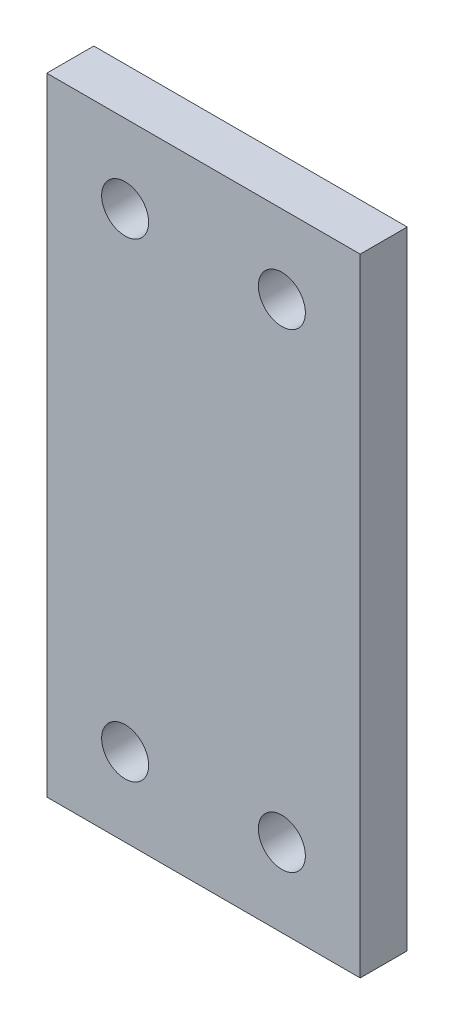
ISO-10303-21;
HEADER;
FILE_DESCRIPTION(('STEP AP214'),'2;1');
FILE_NAME('part.step','',(''),(''),'','','');
FILE_SCHEMA(('AUTOMOTIVE_DESIGN { 1 0 10303 214 1 1 1 1 }'));
ENDSEC;
DATA;
#1=APPLICATION_CONTEXT('core data for automotive mechanical design processes');
#2=APPLICATION_PROTOCOL_DEFINITION('international standard','automotive_design',2000,#1);
#3=PRODUCT_CONTEXT('',#1,'mechanical');
#4=PRODUCT('Part','Part','',(#3));
#5=PRODUCT_RELATED_PRODUCT_CATEGORY('part','',(#4));
#6=PRODUCT_DEFINITION_FORMATION('','',#4);
#7=PRODUCT_DEFINITION_CONTEXT('part definition',#1,'design');
#8=PRODUCT_DEFINITION('design','',#6,#7);
#9=PRODUCT_DEFINITION_SHAPE('','',#8);
#10=(LENGTH_UNIT() NAMED_UNIT(*) SI_UNIT(.MILLI.,.METRE.));
#11=(NAMED_UNIT(*) PLANE_ANGLE_UNIT() SI_UNIT($,.RADIAN.));
#12=(NAMED_UNIT(*) SI_UNIT($,.STERADIAN.) SOLID_ANGLE_UNIT());
#13=UNCERTAINTY_MEASURE_WITH_UNIT(LENGTH_MEASURE(1.E-05),#10,'distance_accuracy_value','');
#14=(GEOMETRIC_REPRESENTATION_CONTEXT(3) GLOBAL_UNCERTAINTY_ASSIGNED_CONTEXT((#13)) GLOBAL_UNIT_ASSIGNED_CONTEXT((#10,
#11,#12)) REPRESENTATION_CONTEXT('',''));
#15=CARTESIAN_POINT('',(0.,0.,0.));
#16=DIRECTION('',(0.,0.,1.));
#17=DIRECTION('',(1.,0.,0.));
#18=AXIS2_PLACEMENT_3D('',#15,#16,#17);
#19=CARTESIAN_POINT('',(0.,0.,0.));
#20=DIRECTION('',(0.,0.,-1.));
#21=DIRECTION('',(-1.,0.,0.));
#22=AXIS2_PLACEMENT_3D('',#19,#20,#21);
#23=PLANE('',#22);
#24=CARTESIAN_POINT('',(5.,5.,0.));
#25=DIRECTION('',(0.,0.,-1.));
#26=DIRECTION('',(-1.,0.,0.));
#27=AXIS2_PLACEMENT_3D('',#24,#25,#26);
#28=CIRCLE('',#27,1.5);
#29=CARTESIAN_POINT('',(3.5,5.,0.));
#30=VERTEX_POINT('',#29);
#31=EDGE_CURVE('E90',#30,#30,#28,.F.);
#32=ORIENTED_EDGE('',*,*,#31,.T.);
#33=EDGE_LOOP('',(#32));
#34=FACE_BOUND('',#33,.T.);
#35=CARTESIAN_POINT('',(15.,35.,0.));
#36=DIRECTION('',(0.,0.,-1.));
#37=DIRECTION('',(-1.,0.,0.));
#38=AXIS2_PLACEMENT_3D('',#35,#36,#37);
#39=CIRCLE('',#38,1.49999999999999);
#40=CARTESIAN_POINT('',(13.5,35.,0.));
#41=VERTEX_POINT('',#40);
#42=EDGE_CURVE('E95',#41,#41,#39,.F.);
#43=ORIENTED_EDGE('',*,*,#42,.T.);
#44=EDGE_LOOP('',(#43));
#45=FACE_BOUND('',#44,.T.);
#46=DIRECTION('',(0.,1.,0.));
#47=VECTOR('',#46,1.);
#48=CARTESIAN_POINT('',(20.,0.,0.));
#49=LINE('',#48,#47);
#50=CARTESIAN_POINT('',(20.,40.,0.));
#51=VERTEX_POINT('',#50);
#52=CARTESIAN_POINT('',(20.,0.,0.));
#53=VERTEX_POINT('',#52);
#54=EDGE_CURVE('E56',#51,#53,#49,.F.);
#55=ORIENTED_EDGE('',*,*,#54,.T.);
#56=DIRECTION('',(1.,0.,0.));
#57=VECTOR('',#56,1.);
#58=CARTESIAN_POINT('',(0.,0.,0.));
#59=LINE('',#58,#57);
#60=CARTESIAN_POINT('',(0.,0.,0.));
#61=VERTEX_POINT('',#60);
#62=EDGE_CURVE('E108',#53,#61,#59,.F.);
#63=ORIENTED_EDGE('',*,*,#62,.T.);
#64=DIRECTION('',(0.,1.,0.));
#65=VECTOR('',#64,1.);
#66=CARTESIAN_POINT('',(0.,0.,0.));
#67=LINE('',#66,#65);
#68=CARTESIAN_POINT('',(0.,40.,0.));
#69=VERTEX_POINT('',#68);
#70=EDGE_CURVE('E61',#61,#69,#67,.T.);
#71=ORIENTED_EDGE('',*,*,#70,.T.);
#72=DIRECTION('',(1.,0.,0.));
#73=VECTOR('',#72,1.);
#74=CARTESIAN_POINT('',(0.,40.,0.));
#75=LINE('',#74,#73);
#76=EDGE_CURVE('E59',#69,#51,#75,.T.);
#77=ORIENTED_EDGE('',*,*,#76,.T.);
#78=EDGE_LOOP('',(#55,#63,#71,#77));
#79=FACE_BOUND('',#78,.T.);
#80=CARTESIAN_POINT('',(5.,35.,0.));
#81=DIRECTION('',(0.,0.,-1.));
#82=DIRECTION('',(-1.,0.,0.));
#83=AXIS2_PLACEMENT_3D('',#80,#81,#82);
#84=CIRCLE('',#83,1.5);
#85=CARTESIAN_POINT('',(3.5,35.,0.));
#86=VERTEX_POINT('',#85);
#87=EDGE_CURVE('E20',#86,#86,#84,.F.);
#88=ORIENTED_EDGE('',*,*,#87,.T.);
#89=EDGE_LOOP('',(#88));
#90=FACE_BOUND('',#89,.T.);
#91=CARTESIAN_POINT('',(15.,5.,0.));
#92=DIRECTION('',(0.,0.,-1.));
#93=DIRECTION('',(-1.,0.,0.));
#94=AXIS2_PLACEMENT_3D('',#91,#92,#93);
#95=CIRCLE('',#94,1.49999999999999);
#96=CARTESIAN_POINT('',(13.5,5.,0.));
#97=VERTEX_POINT('',#96);
#98=EDGE_CURVE('E93',#97,#97,#95,.F.);
#99=ORIENTED_EDGE('',*,*,#98,.T.);
#100=EDGE_LOOP('',(#99));
#101=FACE_BOUND('',#100,.T.);
#102=ADVANCED_FACE('F17',(#34,#45,#79,#90,#101),#23,.T.);
#103=CARTESIAN_POINT('',(0.,40.,3.));
#104=DIRECTION('',(0.,-1.,0.));
#105=DIRECTION('',(0.,0.,-1.));
#106=AXIS2_PLACEMENT_3D('',#103,#104,#105);
#107=PLANE('',#106);
#108=DIRECTION('',(0.,0.,-1.));
#109=VECTOR('',#108,1.);
#110=CARTESIAN_POINT('',(0.,40.,3.));
#111=LINE('',#110,#109);
#112=CARTESIAN_POINT('',(0.,40.,3.));
#113=VERTEX_POINT('',#112);
#114=EDGE_CURVE('E102',#69,#113,#111,.F.);
#115=ORIENTED_EDGE('',*,*,#114,.T.);
#116=DIRECTION('',(-1.,0.,0.));
#117=VECTOR('',#116,1.);
#118=CARTESIAN_POINT('',(0.,40.,3.));
#119=LINE('',#118,#117);
#120=CARTESIAN_POINT('',(20.,40.,3.));
#121=VERTEX_POINT('',#120);
#122=EDGE_CURVE('E77',#113,#121,#119,.F.);
#123=ORIENTED_EDGE('',*,*,#122,.T.);
#124=DIRECTION('',(0.,0.,1.));
#125=VECTOR('',#124,1.);
#126=CARTESIAN_POINT('',(20.,40.,3.));
#127=LINE('',#126,#125);
#128=EDGE_CURVE('E66',#121,#51,#127,.F.);
#129=ORIENTED_EDGE('',*,*,#128,.T.);
#130=ORIENTED_EDGE('',*,*,#76,.F.);
#131=EDGE_LOOP('',(#115,#123,#129,#130));
#132=FACE_BOUND('',#131,.T.);
#133=ADVANCED_FACE('F76',(#132),#107,.F.);
#134=CARTESIAN_POINT('',(20.,0.,3.));
#135=DIRECTION('',(-1.,0.,0.));
#136=DIRECTION('',(0.,0.,1.));
#137=AXIS2_PLACEMENT_3D('',#134,#135,#136);
#138=PLANE('',#137);
#139=ORIENTED_EDGE('',*,*,#128,.F.);
#140=DIRECTION('',(0.,1.,0.));
#141=VECTOR('',#140,1.);
#142=CARTESIAN_POINT('',(20.,0.,3.));
#143=LINE('',#142,#141);
#144=CARTESIAN_POINT('',(20.,0.,3.));
#145=VERTEX_POINT('',#144);
#146=EDGE_CURVE('E116',#121,#145,#143,.F.);
#147=ORIENTED_EDGE('',*,*,#146,.T.);
#148=DIRECTION('',(0.,0.,1.));
#149=VECTOR('',#148,1.);
#150=CARTESIAN_POINT('',(20.,0.,3.));
#151=LINE('',#150,#149);
#152=EDGE_CURVE('E73',#145,#53,#151,.F.);
#153=ORIENTED_EDGE('',*,*,#152,.T.);
#154=ORIENTED_EDGE('',*,*,#54,.F.);
#155=EDGE_LOOP('',(#139,#147,#153,#154));
#156=FACE_BOUND('',#155,.T.);
#157=ADVANCED_FACE('F70',(#156),#138,.F.);
#158=CARTESIAN_POINT('',(0.,0.,3.));
#159=DIRECTION('',(0.,1.,0.));
#160=DIRECTION('',(0.,0.,1.));
#161=AXIS2_PLACEMENT_3D('',#158,#159,#160);
#162=PLANE('',#161);
#163=ORIENTED_EDGE('',*,*,#152,.F.);
#164=DIRECTION('',(-1.,0.,0.));
#165=VECTOR('',#164,1.);
#166=CARTESIAN_POINT('',(0.,0.,3.));
#167=LINE('',#166,#165);
#168=CARTESIAN_POINT('',(0.,0.,3.));
#169=VERTEX_POINT('',#168);
#170=EDGE_CURVE('E114',#145,#169,#167,.T.);
#171=ORIENTED_EDGE('',*,*,#170,.T.);
#172=DIRECTION('',(0.,0.,-1.));
#173=VECTOR('',#172,1.);
#174=CARTESIAN_POINT('',(0.,0.,3.));
#175=LINE('',#174,#173);
#176=EDGE_CURVE('E35',#169,#61,#175,.T.);
#177=ORIENTED_EDGE('',*,*,#176,.T.);
#178=ORIENTED_EDGE('',*,*,#62,.F.);
#179=EDGE_LOOP('',(#163,#171,#177,#178));
#180=FACE_BOUND('',#179,.T.);
#181=ADVANCED_FACE('F112',(#180),#162,.F.);
#182=CARTESIAN_POINT('',(0.,0.,3.));
#183=DIRECTION('',(1.,0.,0.));
#184=DIRECTION('',(0.,0.,-1.));
#185=AXIS2_PLACEMENT_3D('',#182,#183,#184);
#186=PLANE('',#185);
#187=ORIENTED_EDGE('',*,*,#176,.F.);
#188=DIRECTION('',(0.,1.,0.));
#189=VECTOR('',#188,1.);
#190=CARTESIAN_POINT('',(0.,0.,3.));
#191=LINE('',#190,#189);
#192=EDGE_CURVE('E89',#169,#113,#191,.T.);
#193=ORIENTED_EDGE('',*,*,#192,.T.);
#194=ORIENTED_EDGE('',*,*,#114,.F.);
#195=ORIENTED_EDGE('',*,*,#70,.F.);
#196=EDGE_LOOP('',(#187,#193,#194,#195));
#197=FACE_BOUND('',#196,.T.);
#198=ADVANCED_FACE('F110',(#197),#186,.F.);
#199=CARTESIAN_POINT('',(5.,35.,3.));
#200=DIRECTION('',(0.,0.,-1.));
#201=DIRECTION('',(-1.,0.,0.));
#202=AXIS2_PLACEMENT_3D('',#199,#200,#201);
#203=CYLINDRICAL_SURFACE('',#202,1.5);
#204=ORIENTED_EDGE('',*,*,#87,.F.);
#205=EDGE_LOOP('',(#204));
#206=FACE_BOUND('',#205,.T.);
#207=CARTESIAN_POINT('',(5.,35.,3.));
#208=DIRECTION('',(0.,0.,-1.));
#209=DIRECTION('',(-1.,0.,0.));
#210=AXIS2_PLACEMENT_3D('',#207,#208,#209);
#211=CIRCLE('',#210,1.5);
#212=CARTESIAN_POINT('',(3.5,35.,3.));
#213=VERTEX_POINT('',#212);
#214=EDGE_CURVE('E86',#213,#213,#211,.F.);
#215=ORIENTED_EDGE('',*,*,#214,.T.);
#216=EDGE_LOOP('',(#215));
#217=FACE_BOUND('',#216,.T.);
#218=ADVANCED_FACE('F140',(#206,#217),#203,.F.);
#219=CARTESIAN_POINT('',(15.,35.,3.));
#220=DIRECTION('',(0.,0.,-1.));
#221=DIRECTION('',(-1.,0.,0.));
#222=AXIS2_PLACEMENT_3D('',#219,#220,#221);
#223=CYLINDRICAL_SURFACE('',#222,1.49999999999999);
#224=ORIENTED_EDGE('',*,*,#42,.F.);
#225=EDGE_LOOP('',(#224));
#226=FACE_BOUND('',#225,.T.);
#227=CARTESIAN_POINT('',(15.,35.,3.));
#228=DIRECTION('',(0.,0.,-1.));
#229=DIRECTION('',(-1.,0.,0.));
#230=AXIS2_PLACEMENT_3D('',#227,#228,#229);
#231=CIRCLE('',#230,1.49999999999999);
#232=CARTESIAN_POINT('',(13.5,35.,3.));
#233=VERTEX_POINT('',#232);
#234=EDGE_CURVE('E83',#233,#233,#231,.F.);
#235=ORIENTED_EDGE('',*,*,#234,.T.);
#236=EDGE_LOOP('',(#235));
#237=FACE_BOUND('',#236,.T.);
#238=ADVANCED_FACE('F136',(#226,#237),#223,.F.);
#239=CARTESIAN_POINT('',(15.,5.,3.));
#240=DIRECTION('',(0.,0.,-1.));
#241=DIRECTION('',(-1.,0.,0.));
#242=AXIS2_PLACEMENT_3D('',#239,#240,#241);
#243=CYLINDRICAL_SURFACE('',#242,1.49999999999999);
#244=ORIENTED_EDGE('',*,*,#98,.F.);
#245=EDGE_LOOP('',(#244));
#246=FACE_BOUND('',#245,.T.);
#247=CARTESIAN_POINT('',(15.,5.,3.));
#248=DIRECTION('',(0.,0.,-1.));
#249=DIRECTION('',(-1.,0.,0.));
#250=AXIS2_PLACEMENT_3D('',#247,#248,#249);
#251=CIRCLE('',#250,1.49999999999999);
#252=CARTESIAN_POINT('',(13.5,5.,3.));
#253=VERTEX_POINT('',#252);
#254=EDGE_CURVE('E26',#253,#253,#251,.F.);
#255=ORIENTED_EDGE('',*,*,#254,.T.);
#256=EDGE_LOOP('',(#255));
#257=FACE_BOUND('',#256,.T.);
#258=ADVANCED_FACE('F128',(#246,#257),#243,.F.);
#259=CARTESIAN_POINT('',(5.,5.,3.));
#260=DIRECTION('',(0.,0.,-1.));
#261=DIRECTION('',(-1.,0.,0.));
#262=AXIS2_PLACEMENT_3D('',#259,#260,#261);
#263=CYLINDRICAL_SURFACE('',#262,1.5);
#264=ORIENTED_EDGE('',*,*,#31,.F.);
#265=EDGE_LOOP('',(#264));
#266=FACE_BOUND('',#265,.T.);
#267=CARTESIAN_POINT('',(5.,5.,3.));
#268=DIRECTION('',(0.,0.,-1.));
#269=DIRECTION('',(-1.,0.,0.));
#270=AXIS2_PLACEMENT_3D('',#267,#268,#269);
#271=CIRCLE('',#270,1.5);
#272=CARTESIAN_POINT('',(3.5,5.,3.));
#273=VERTEX_POINT('',#272);
#274=EDGE_CURVE('E11',#273,#273,#271,.F.);
#275=ORIENTED_EDGE('',*,*,#274,.T.);
#276=EDGE_LOOP('',(#275));
#277=FACE_BOUND('',#276,.T.);
#278=ADVANCED_FACE('F121',(#266,#277),#263,.F.);
#279=CARTESIAN_POINT('',(0.,0.,3.));
#280=DIRECTION('',(0.,0.,-1.));
#281=DIRECTION('',(-1.,0.,0.));
#282=AXIS2_PLACEMENT_3D('',#279,#280,#281);
#283=PLANE('',#282);
#284=ORIENTED_EDGE('',*,*,#274,.F.);
#285=EDGE_LOOP('',(#284));
#286=FACE_BOUND('',#285,.T.);
#287=ORIENTED_EDGE('',*,*,#254,.F.);
#288=EDGE_LOOP('',(#287));
#289=FACE_BOUND('',#288,.T.);
#290=ORIENTED_EDGE('',*,*,#234,.F.);
#291=EDGE_LOOP('',(#290));
#292=FACE_BOUND('',#291,.T.);
#293=ORIENTED_EDGE('',*,*,#214,.F.);
#294=EDGE_LOOP('',(#293));
#295=FACE_BOUND('',#294,.T.);
#296=ORIENTED_EDGE('',*,*,#170,.F.);
#297=ORIENTED_EDGE('',*,*,#146,.F.);
#298=ORIENTED_EDGE('',*,*,#122,.F.);
#299=ORIENTED_EDGE('',*,*,#192,.F.);
#300=EDGE_LOOP('',(#296,#297,#298,#299));
#301=FACE_BOUND('',#300,.T.);
#302=ADVANCED_FACE('F119',(#286,#289,#292,#295,#301),#283,.F.);
#303=CLOSED_SHELL('',(#102,#133,#157,#181,#198,#218,#238,#258,#278,#302));
#304=MANIFOLD_SOLID_BREP('B1',#303);
#305=ADVANCED_BREP_SHAPE_REPRESENTATION('',(#18,#304),#14);
#306=SHAPE_DEFINITION_REPRESENTATION(#9,#305);
ENDSEC;
END-ISO-10303-21;
